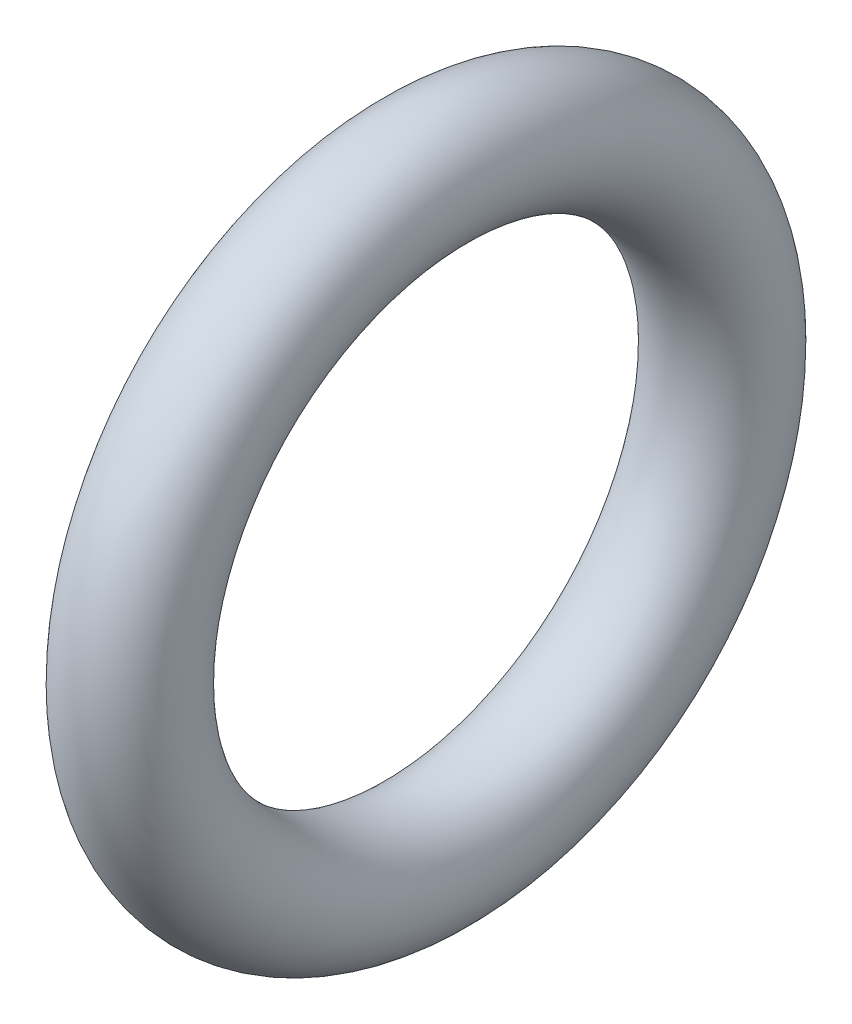
ISO-10303-21;
HEADER;
FILE_DESCRIPTION(('STEP AP214'),'2;1');
FILE_NAME('part.step','',(''),(''),'','','');
FILE_SCHEMA(('AUTOMOTIVE_DESIGN { 1 0 10303 214 1 1 1 1 }'));
ENDSEC;
DATA;
#1=APPLICATION_CONTEXT('core data for automotive mechanical design processes');
#2=APPLICATION_PROTOCOL_DEFINITION('international standard','automotive_design',2000,#1);
#3=PRODUCT_CONTEXT('',#1,'mechanical');
#4=PRODUCT('Part','Part','',(#3));
#5=PRODUCT_RELATED_PRODUCT_CATEGORY('part','',(#4));
#6=PRODUCT_DEFINITION_FORMATION('','',#4);
#7=PRODUCT_DEFINITION_CONTEXT('part definition',#1,'design');
#8=PRODUCT_DEFINITION('design','',#6,#7);
#9=PRODUCT_DEFINITION_SHAPE('','',#8);
#10=(LENGTH_UNIT() NAMED_UNIT(*) SI_UNIT(.MILLI.,.METRE.));
#11=(NAMED_UNIT(*) PLANE_ANGLE_UNIT() SI_UNIT($,.RADIAN.));
#12=(NAMED_UNIT(*) SI_UNIT($,.STERADIAN.) SOLID_ANGLE_UNIT());
#13=UNCERTAINTY_MEASURE_WITH_UNIT(LENGTH_MEASURE(1.E-05),#10,'distance_accuracy_value','');
#14=(GEOMETRIC_REPRESENTATION_CONTEXT(3) GLOBAL_UNCERTAINTY_ASSIGNED_CONTEXT((#13)) GLOBAL_UNIT_ASSIGNED_CONTEXT((#10,
#11,#12)) REPRESENTATION_CONTEXT('',''));
#15=CARTESIAN_POINT('',(0.,0.,0.));
#16=DIRECTION('',(0.,0.,1.));
#17=DIRECTION('',(1.,0.,0.));
#18=AXIS2_PLACEMENT_3D('',#15,#16,#17);
#19=CARTESIAN_POINT('',(-4.24959197119234,0.00690810170150043,0.));
#20=DIRECTION('',(1.,0.,0.));
#21=DIRECTION('',(0.,0.,-1.));
#22=AXIS2_PLACEMENT_3D('',#19,#20,#21);
#23=TOROIDAL_SURFACE('',#22,4.99969743282958,1.);
#24=CARTESIAN_POINT('',(-4.24959197119234,0.00690810170150043,-5.99969743282958));
#25=VERTEX_POINT('',#24);
#26=VERTEX_LOOP('',#25);
#27=FACE_BOUND('',#26,.T.);
#28=ADVANCED_FACE('F13',(#27),#23,.T.);
#29=CLOSED_SHELL('',(#28));
#30=MANIFOLD_SOLID_BREP('B1',#29);
#31=ADVANCED_BREP_SHAPE_REPRESENTATION('',(#18,#30),#14);
#32=SHAPE_DEFINITION_REPRESENTATION(#9,#31);
ENDSEC;
END-ISO-10303-21;
